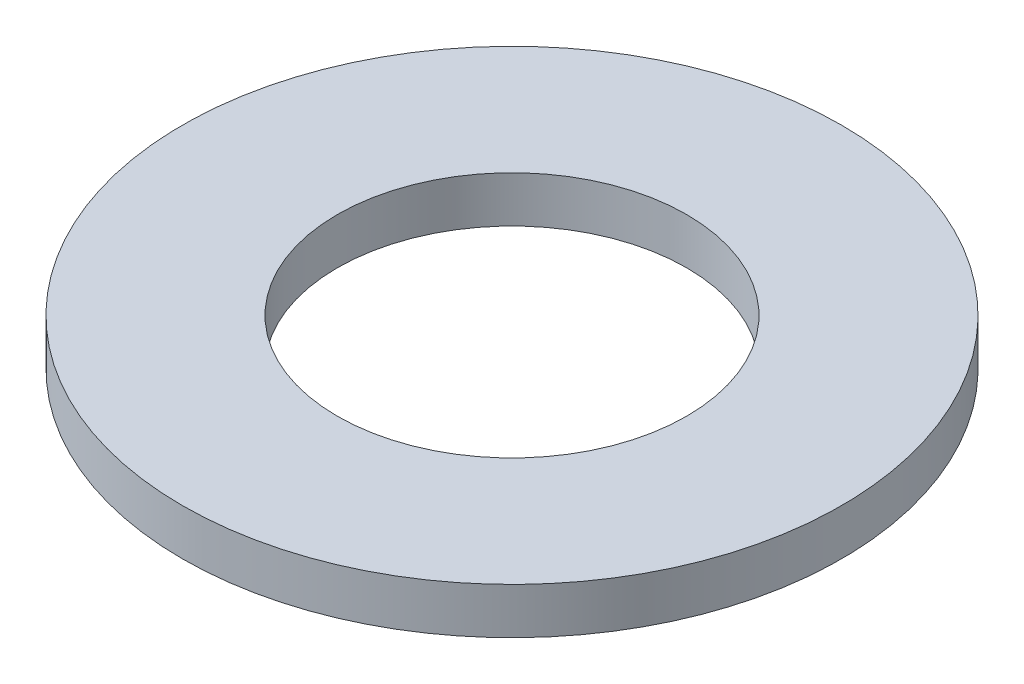
ISO-10303-21;
HEADER;
FILE_DESCRIPTION(('STEP AP214'),'2;1');
FILE_NAME('part.step','',(''),(''),'','','');
FILE_SCHEMA(('AUTOMOTIVE_DESIGN { 1 0 10303 214 1 1 1 1 }'));
ENDSEC;
DATA;
#1=APPLICATION_CONTEXT('core data for automotive mechanical design processes');
#2=APPLICATION_PROTOCOL_DEFINITION('international standard','automotive_design',2000,#1);
#3=PRODUCT_CONTEXT('',#1,'mechanical');
#4=PRODUCT('Part','Part','',(#3));
#5=PRODUCT_RELATED_PRODUCT_CATEGORY('part','',(#4));
#6=PRODUCT_DEFINITION_FORMATION('','',#4);
#7=PRODUCT_DEFINITION_CONTEXT('part definition',#1,'design');
#8=PRODUCT_DEFINITION('design','',#6,#7);
#9=PRODUCT_DEFINITION_SHAPE('','',#8);
#10=(LENGTH_UNIT() NAMED_UNIT(*) SI_UNIT(.MILLI.,.METRE.));
#11=(NAMED_UNIT(*) PLANE_ANGLE_UNIT() SI_UNIT($,.RADIAN.));
#12=(NAMED_UNIT(*) SI_UNIT($,.STERADIAN.) SOLID_ANGLE_UNIT());
#13=UNCERTAINTY_MEASURE_WITH_UNIT(LENGTH_MEASURE(1.E-05),#10,'distance_accuracy_value','');
#14=(GEOMETRIC_REPRESENTATION_CONTEXT(3) GLOBAL_UNCERTAINTY_ASSIGNED_CONTEXT((#13)) GLOBAL_UNIT_ASSIGNED_CONTEXT((#10,
#11,#12)) REPRESENTATION_CONTEXT('',''));
#15=CARTESIAN_POINT('',(0.,0.,0.));
#16=DIRECTION('',(0.,0.,1.));
#17=DIRECTION('',(1.,0.,0.));
#18=AXIS2_PLACEMENT_3D('',#15,#16,#17);
#19=CARTESIAN_POINT('',(0.,0.889,0.));
#20=DIRECTION('',(0.,-1.,0.));
#21=DIRECTION('',(0.,0.,-1.));
#22=AXIS2_PLACEMENT_3D('',#19,#20,#21);
#23=CYLINDRICAL_SURFACE('',#22,6.35);
#24=CARTESIAN_POINT('',(0.,0.889,0.));
#25=DIRECTION('',(0.,1.,0.));
#26=DIRECTION('',(0.,0.,1.));
#27=AXIS2_PLACEMENT_3D('',#24,#25,#26);
#28=CIRCLE('',#27,6.35);
#29=CARTESIAN_POINT('',(0.,0.889,6.35));
#30=VERTEX_POINT('',#29);
#31=EDGE_CURVE('E10',#30,#30,#28,.T.);
#32=ORIENTED_EDGE('',*,*,#31,.F.);
#33=EDGE_LOOP('',(#32));
#34=FACE_BOUND('',#33,.T.);
#35=CARTESIAN_POINT('',(0.,0.,0.));
#36=DIRECTION('',(0.,1.,0.));
#37=DIRECTION('',(0.,0.,1.));
#38=AXIS2_PLACEMENT_3D('',#35,#36,#37);
#39=CIRCLE('',#38,6.35);
#40=CARTESIAN_POINT('',(0.,0.,6.35));
#41=VERTEX_POINT('',#40);
#42=EDGE_CURVE('E40',#41,#41,#39,.T.);
#43=ORIENTED_EDGE('',*,*,#42,.T.);
#44=EDGE_LOOP('',(#43));
#45=FACE_BOUND('',#44,.T.);
#46=ADVANCED_FACE('F37',(#34,#45),#23,.T.);
#47=CARTESIAN_POINT('',(0.,0.889,0.));
#48=DIRECTION('',(0.,1.,0.));
#49=DIRECTION('',(0.,0.,1.));
#50=AXIS2_PLACEMENT_3D('',#47,#48,#49);
#51=PLANE('',#50);
#52=CARTESIAN_POINT('',(0.,0.889,0.));
#53=DIRECTION('',(0.,1.,0.));
#54=DIRECTION('',(0.,0.,1.));
#55=AXIS2_PLACEMENT_3D('',#52,#53,#54);
#56=CIRCLE('',#55,3.3655);
#57=CARTESIAN_POINT('',(0.,0.889,3.3655));
#58=VERTEX_POINT('',#57);
#59=EDGE_CURVE('E49',#58,#58,#56,.T.);
#60=ORIENTED_EDGE('',*,*,#59,.F.);
#61=EDGE_LOOP('',(#60));
#62=FACE_BOUND('',#61,.T.);
#63=ORIENTED_EDGE('',*,*,#31,.T.);
#64=EDGE_LOOP('',(#63));
#65=FACE_BOUND('',#64,.T.);
#66=ADVANCED_FACE('F64',(#62,#65),#51,.T.);
#67=CARTESIAN_POINT('',(0.,0.,0.));
#68=DIRECTION('',(0.,1.,0.));
#69=DIRECTION('',(0.,0.,1.));
#70=AXIS2_PLACEMENT_3D('',#67,#68,#69);
#71=PLANE('',#70);
#72=CARTESIAN_POINT('',(0.,0.,0.));
#73=DIRECTION('',(0.,1.,0.));
#74=DIRECTION('',(0.,0.,1.));
#75=AXIS2_PLACEMENT_3D('',#72,#73,#74);
#76=CIRCLE('',#75,3.3655);
#77=CARTESIAN_POINT('',(0.,0.,3.3655));
#78=VERTEX_POINT('',#77);
#79=EDGE_CURVE('E47',#78,#78,#76,.T.);
#80=ORIENTED_EDGE('',*,*,#79,.T.);
#81=EDGE_LOOP('',(#80));
#82=FACE_BOUND('',#81,.T.);
#83=ORIENTED_EDGE('',*,*,#42,.F.);
#84=EDGE_LOOP('',(#83));
#85=FACE_BOUND('',#84,.T.);
#86=ADVANCED_FACE('F55',(#82,#85),#71,.F.);
#87=CARTESIAN_POINT('',(0.,0.,0.));
#88=DIRECTION('',(0.,1.,0.));
#89=DIRECTION('',(0.,0.,1.));
#90=AXIS2_PLACEMENT_3D('',#87,#88,#89);
#91=CYLINDRICAL_SURFACE('',#90,3.3655);
#92=ORIENTED_EDGE('',*,*,#79,.F.);
#93=EDGE_LOOP('',(#92));
#94=FACE_BOUND('',#93,.T.);
#95=ORIENTED_EDGE('',*,*,#59,.T.);
#96=EDGE_LOOP('',(#95));
#97=FACE_BOUND('',#96,.T.);
#98=ADVANCED_FACE('F58',(#94,#97),#91,.F.);
#99=CLOSED_SHELL('',(#46,#66,#86,#98));
#100=MANIFOLD_SOLID_BREP('B2',#99);
#101=ADVANCED_BREP_SHAPE_REPRESENTATION('',(#18,#100),#14);
#102=SHAPE_DEFINITION_REPRESENTATION(#9,#101);
ENDSEC;
END-ISO-10303-21;
